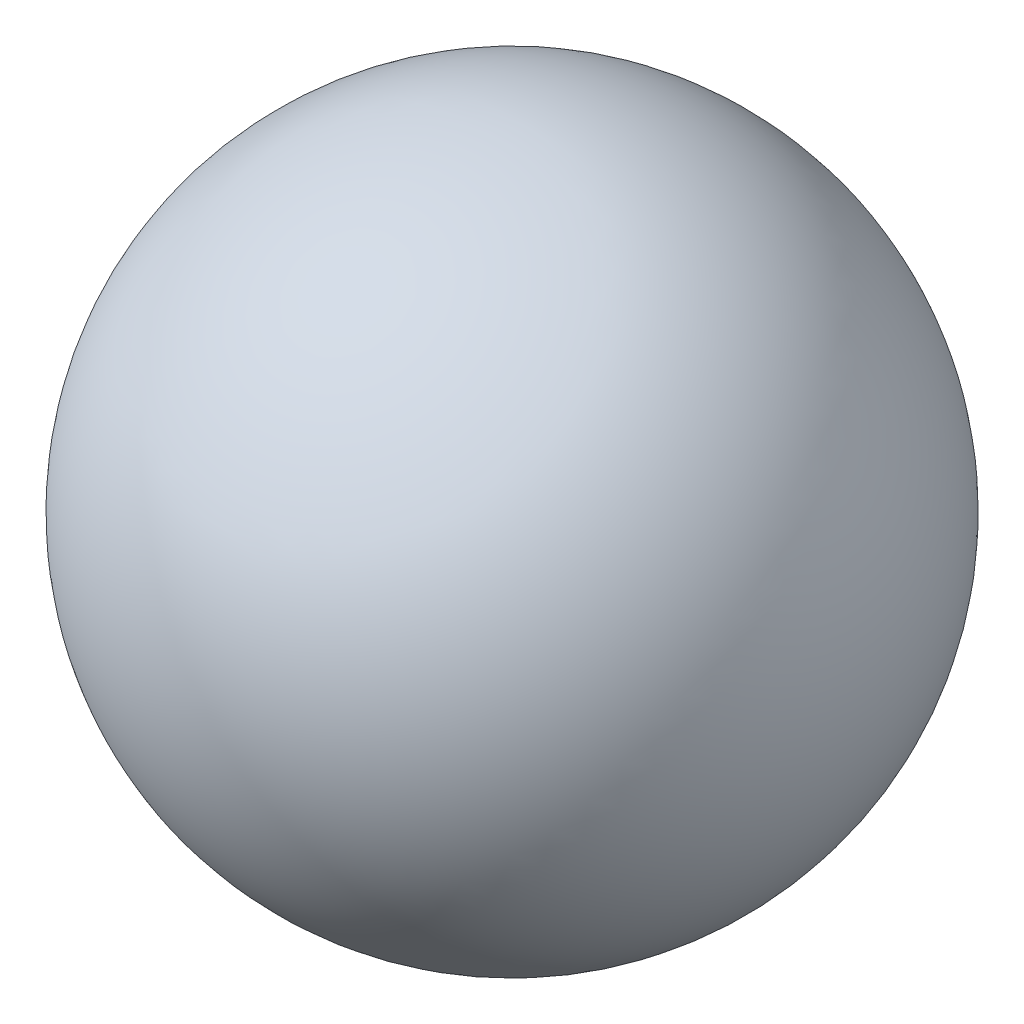
ISO-10303-21;
HEADER;
FILE_DESCRIPTION(('STEP AP214'),'2;1');
FILE_NAME('part.step','',(''),(''),'','','');
FILE_SCHEMA(('AUTOMOTIVE_DESIGN { 1 0 10303 214 1 1 1 1 }'));
ENDSEC;
DATA;
#1=APPLICATION_CONTEXT('core data for automotive mechanical design processes');
#2=APPLICATION_PROTOCOL_DEFINITION('international standard','automotive_design',2000,#1);
#3=PRODUCT_CONTEXT('',#1,'mechanical');
#4=PRODUCT('Part','Part','',(#3));
#5=PRODUCT_RELATED_PRODUCT_CATEGORY('part','',(#4));
#6=PRODUCT_DEFINITION_FORMATION('','',#4);
#7=PRODUCT_DEFINITION_CONTEXT('part definition',#1,'design');
#8=PRODUCT_DEFINITION('design','',#6,#7);
#9=PRODUCT_DEFINITION_SHAPE('','',#8);
#10=(LENGTH_UNIT() NAMED_UNIT(*) SI_UNIT(.MILLI.,.METRE.));
#11=(NAMED_UNIT(*) PLANE_ANGLE_UNIT() SI_UNIT($,.RADIAN.));
#12=(NAMED_UNIT(*) SI_UNIT($,.STERADIAN.) SOLID_ANGLE_UNIT());
#13=UNCERTAINTY_MEASURE_WITH_UNIT(LENGTH_MEASURE(1.E-05),#10,'distance_accuracy_value','');
#14=(GEOMETRIC_REPRESENTATION_CONTEXT(3) GLOBAL_UNCERTAINTY_ASSIGNED_CONTEXT((#13)) GLOBAL_UNIT_ASSIGNED_CONTEXT((#10,
#11,#12)) REPRESENTATION_CONTEXT('',''));
#15=CARTESIAN_POINT('',(0.,0.,0.));
#16=DIRECTION('',(0.,0.,1.));
#17=DIRECTION('',(1.,0.,0.));
#18=AXIS2_PLACEMENT_3D('',#15,#16,#17);
#19=CARTESIAN_POINT('',(0.,0.,0.));
#20=DIRECTION('',(0.,0.,1.));
#21=DIRECTION('',(-1.,0.,0.));
#22=AXIS2_PLACEMENT_3D('',#19,#20,#21);
#23=SPHERICAL_SURFACE('',#22,13.49375);
#24=CARTESIAN_POINT('',(0.,0.,13.49375));
#25=VERTEX_POINT('',#24);
#26=VERTEX_LOOP('',#25);
#27=FACE_BOUND('',#26,.T.);
#28=ADVANCED_FACE('F30',(#27),#23,.T.);
#29=CLOSED_SHELL('',(#28));
#30=MANIFOLD_SOLID_BREP('B2',#29);
#31=ADVANCED_BREP_SHAPE_REPRESENTATION('',(#18,#30),#14);
#32=SHAPE_DEFINITION_REPRESENTATION(#9,#31);
ENDSEC;
END-ISO-10303-21;
